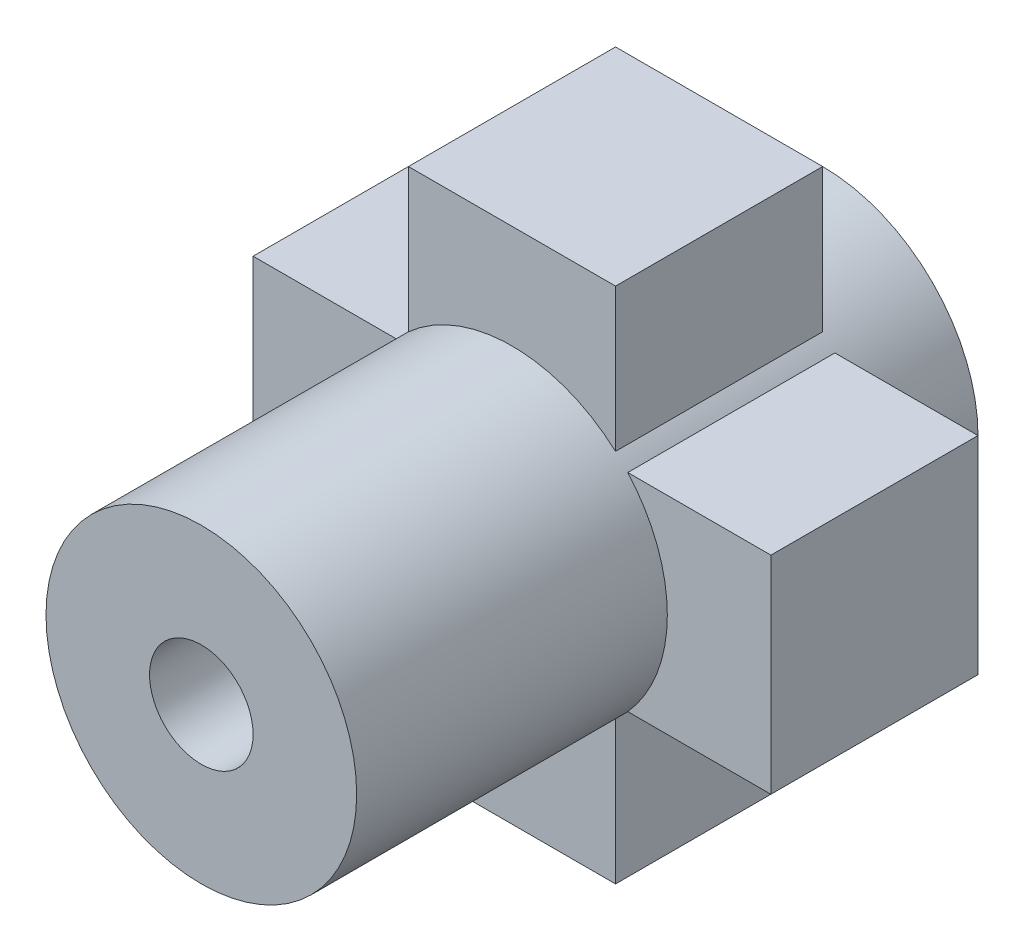
ISO-10303-21;
HEADER;
FILE_DESCRIPTION(('STEP AP214'),'2;1');
FILE_NAME('part.step','',(''),(''),'','','');
FILE_SCHEMA(('AUTOMOTIVE_DESIGN { 1 0 10303 214 1 1 1 1 }'));
ENDSEC;
DATA;
#1=APPLICATION_CONTEXT('core data for automotive mechanical design processes');
#2=APPLICATION_PROTOCOL_DEFINITION('international standard','automotive_design',2000,#1);
#3=PRODUCT_CONTEXT('',#1,'mechanical');
#4=PRODUCT('Part','Part','',(#3));
#5=PRODUCT_RELATED_PRODUCT_CATEGORY('part','',(#4));
#6=PRODUCT_DEFINITION_FORMATION('','',#4);
#7=PRODUCT_DEFINITION_CONTEXT('part definition',#1,'design');
#8=PRODUCT_DEFINITION('design','',#6,#7);
#9=PRODUCT_DEFINITION_SHAPE('','',#8);
#10=(LENGTH_UNIT() NAMED_UNIT(*) SI_UNIT(.MILLI.,.METRE.));
#11=(NAMED_UNIT(*) PLANE_ANGLE_UNIT() SI_UNIT($,.RADIAN.));
#12=(NAMED_UNIT(*) SI_UNIT($,.STERADIAN.) SOLID_ANGLE_UNIT());
#13=UNCERTAINTY_MEASURE_WITH_UNIT(LENGTH_MEASURE(1.E-05),#10,'distance_accuracy_value','');
#14=(GEOMETRIC_REPRESENTATION_CONTEXT(3) GLOBAL_UNCERTAINTY_ASSIGNED_CONTEXT((#13)) GLOBAL_UNIT_ASSIGNED_CONTEXT((#10,
#11,#12)) REPRESENTATION_CONTEXT('',''));
#15=CARTESIAN_POINT('',(0.,0.,0.));
#16=DIRECTION('',(0.,0.,1.));
#17=DIRECTION('',(1.,0.,0.));
#18=AXIS2_PLACEMENT_3D('',#15,#16,#17);
#19=CARTESIAN_POINT('',(0.,0.,10.));
#20=DIRECTION('',(0.,0.,1.));
#21=DIRECTION('',(1.,0.,0.));
#22=AXIS2_PLACEMENT_3D('',#19,#20,#21);
#23=PLANE('',#22);
#24=CARTESIAN_POINT('',(0.,0.,10.));
#25=DIRECTION('',(0.,0.,1.));
#26=DIRECTION('',(1.,0.,0.));
#27=AXIS2_PLACEMENT_3D('',#24,#25,#26);
#28=CIRCLE('',#27,7.5);
#29=CARTESIAN_POINT('',(5.00000000000004,5.59016994374944,10.));
#30=VERTEX_POINT('',#29);
#31=CARTESIAN_POINT('',(-4.99999999999996,5.59016994374951,10.));
#32=VERTEX_POINT('',#31);
#33=EDGE_CURVE('E153',#30,#32,#28,.T.);
#34=ORIENTED_EDGE('',*,*,#33,.F.);
#35=DIRECTION('',(0.,1.,0.));
#36=VECTOR('',#35,1.);
#37=CARTESIAN_POINT('',(5.,0.,10.));
#38=LINE('',#37,#36);
#39=CARTESIAN_POINT('',(5.00000000000009,12.5,10.));
#40=VERTEX_POINT('',#39);
#41=EDGE_CURVE('E309',#30,#40,#38,.T.);
#42=ORIENTED_EDGE('',*,*,#41,.T.);
#43=DIRECTION('',(-1.,0.,0.));
#44=VECTOR('',#43,1.);
#45=CARTESIAN_POINT('',(0.,12.5,10.));
#46=LINE('',#45,#44);
#47=CARTESIAN_POINT('',(-4.99999999999991,12.5,10.));
#48=VERTEX_POINT('',#47);
#49=EDGE_CURVE('E174',#40,#48,#46,.T.);
#50=ORIENTED_EDGE('',*,*,#49,.T.);
#51=DIRECTION('',(0.,1.,0.));
#52=VECTOR('',#51,1.);
#53=CARTESIAN_POINT('',(-5.,0.,10.));
#54=LINE('',#53,#52);
#55=EDGE_CURVE('E168',#32,#48,#54,.T.);
#56=ORIENTED_EDGE('',*,*,#55,.F.);
#57=EDGE_LOOP('',(#34,#42,#50,#56));
#58=FACE_BOUND('',#57,.T.);
#59=ADVANCED_FACE('F43',(#58),#23,.T.);
#60=CARTESIAN_POINT('',(-5.59016994374946,5.00000000000002,10.));
#61=VERTEX_POINT('',#60);
#62=CARTESIAN_POINT('',(-5.59016994374949,-4.99999999999998,10.));
#63=VERTEX_POINT('',#62);
#64=EDGE_CURVE('E145',#61,#63,#28,.T.);
#65=ORIENTED_EDGE('',*,*,#64,.F.);
#66=DIRECTION('',(-1.,0.,0.));
#67=VECTOR('',#66,1.);
#68=CARTESIAN_POINT('',(0.,5.,10.));
#69=LINE('',#68,#67);
#70=CARTESIAN_POINT('',(-12.5,5.00000000000004,10.));
#71=VERTEX_POINT('',#70);
#72=EDGE_CURVE('E149',#61,#71,#69,.T.);
#73=ORIENTED_EDGE('',*,*,#72,.T.);
#74=DIRECTION('',(0.,-1.,0.));
#75=VECTOR('',#74,1.);
#76=CARTESIAN_POINT('',(-12.5,0.,10.));
#77=LINE('',#76,#75);
#78=CARTESIAN_POINT('',(-12.5,-4.99999999999996,10.));
#79=VERTEX_POINT('',#78);
#80=EDGE_CURVE('E62',#71,#79,#77,.T.);
#81=ORIENTED_EDGE('',*,*,#80,.T.);
#82=DIRECTION('',(-1.,0.,0.));
#83=VECTOR('',#82,1.);
#84=CARTESIAN_POINT('',(0.,-5.,10.));
#85=LINE('',#84,#83);
#86=EDGE_CURVE('E150',#63,#79,#85,.T.);
#87=ORIENTED_EDGE('',*,*,#86,.F.);
#88=EDGE_LOOP('',(#65,#73,#81,#87));
#89=FACE_BOUND('',#88,.T.);
#90=ADVANCED_FACE('F147',(#89),#23,.T.);
#91=CARTESIAN_POINT('',(-5.,-5.59016994374948,10.));
#92=VERTEX_POINT('',#91);
#93=CARTESIAN_POINT('',(5.,-5.59016994374947,10.));
#94=VERTEX_POINT('',#93);
#95=EDGE_CURVE('E154',#92,#94,#28,.T.);
#96=ORIENTED_EDGE('',*,*,#95,.F.);
#97=DIRECTION('',(0.,-1.,0.));
#98=VECTOR('',#97,1.);
#99=CARTESIAN_POINT('',(-5.,0.,10.));
#100=LINE('',#99,#98);
#101=CARTESIAN_POINT('',(-5.,-12.5,10.));
#102=VERTEX_POINT('',#101);
#103=EDGE_CURVE('E360',#92,#102,#100,.T.);
#104=ORIENTED_EDGE('',*,*,#103,.T.);
#105=DIRECTION('',(1.,0.,0.));
#106=VECTOR('',#105,1.);
#107=CARTESIAN_POINT('',(0.,-12.5,10.));
#108=LINE('',#107,#106);
#109=CARTESIAN_POINT('',(5.,-12.5,10.));
#110=VERTEX_POINT('',#109);
#111=EDGE_CURVE('E357',#102,#110,#108,.T.);
#112=ORIENTED_EDGE('',*,*,#111,.T.);
#113=DIRECTION('',(0.,-1.,0.));
#114=VECTOR('',#113,1.);
#115=CARTESIAN_POINT('',(5.,0.,10.));
#116=LINE('',#115,#114);
#117=EDGE_CURVE('E353',#94,#110,#116,.T.);
#118=ORIENTED_EDGE('',*,*,#117,.F.);
#119=EDGE_LOOP('',(#96,#104,#112,#118));
#120=FACE_BOUND('',#119,.T.);
#121=ADVANCED_FACE('F379',(#120),#23,.T.);
#122=CARTESIAN_POINT('',(0.,0.,0.));
#123=DIRECTION('',(0.,0.,1.));
#124=DIRECTION('',(1.,0.,0.));
#125=AXIS2_PLACEMENT_3D('',#122,#123,#124);
#126=PLANE('',#125);
#127=DIRECTION('',(0.,1.,0.));
#128=VECTOR('',#127,1.);
#129=CARTESIAN_POINT('',(5.,0.,0.));
#130=LINE('',#129,#128);
#131=CARTESIAN_POINT('',(5.00000000000004,5.59016994374944,0.));
#132=VERTEX_POINT('',#131);
#133=CARTESIAN_POINT('',(5.00000000000009,12.5,0.));
#134=VERTEX_POINT('',#133);
#135=EDGE_CURVE('E204',#132,#134,#130,.T.);
#136=ORIENTED_EDGE('',*,*,#135,.F.);
#137=CARTESIAN_POINT('',(0.,0.,0.));
#138=DIRECTION('',(0.,0.,1.));
#139=DIRECTION('',(1.,0.,0.));
#140=AXIS2_PLACEMENT_3D('',#137,#138,#139);
#141=CIRCLE('',#140,7.5);
#142=CARTESIAN_POINT('',(-4.99999999999996,5.59016994374951,0.));
#143=VERTEX_POINT('',#142);
#144=EDGE_CURVE('E11',#132,#143,#141,.T.);
#145=ORIENTED_EDGE('',*,*,#144,.T.);
#146=DIRECTION('',(0.,1.,0.));
#147=VECTOR('',#146,1.);
#148=CARTESIAN_POINT('',(-5.,0.,0.));
#149=LINE('',#148,#147);
#150=CARTESIAN_POINT('',(-4.99999999999991,12.5,0.));
#151=VERTEX_POINT('',#150);
#152=EDGE_CURVE('E211',#143,#151,#149,.T.);
#153=ORIENTED_EDGE('',*,*,#152,.T.);
#154=DIRECTION('',(-1.,0.,0.));
#155=VECTOR('',#154,1.);
#156=CARTESIAN_POINT('',(0.,12.5,0.));
#157=LINE('',#156,#155);
#158=EDGE_CURVE('E207',#134,#151,#157,.T.);
#159=ORIENTED_EDGE('',*,*,#158,.F.);
#160=EDGE_LOOP('',(#136,#145,#153,#159));
#161=FACE_BOUND('',#160,.T.);
#162=ADVANCED_FACE('F339',(#161),#126,.F.);
#163=DIRECTION('',(-1.,0.,0.));
#164=VECTOR('',#163,1.);
#165=CARTESIAN_POINT('',(0.,5.,0.));
#166=LINE('',#165,#164);
#167=CARTESIAN_POINT('',(-5.59016994374946,5.00000000000002,0.));
#168=VERTEX_POINT('',#167);
#169=CARTESIAN_POINT('',(-12.5,5.00000000000004,0.));
#170=VERTEX_POINT('',#169);
#171=EDGE_CURVE('E95',#168,#170,#166,.T.);
#172=ORIENTED_EDGE('',*,*,#171,.F.);
#173=CARTESIAN_POINT('',(-5.59016994374949,-4.99999999999998,0.));
#174=VERTEX_POINT('',#173);
#175=EDGE_CURVE('E54',#168,#174,#141,.T.);
#176=ORIENTED_EDGE('',*,*,#175,.T.);
#177=DIRECTION('',(-1.,0.,0.));
#178=VECTOR('',#177,1.);
#179=CARTESIAN_POINT('',(0.,-5.,0.));
#180=LINE('',#179,#178);
#181=CARTESIAN_POINT('',(-12.5,-4.99999999999996,0.));
#182=VERTEX_POINT('',#181);
#183=EDGE_CURVE('E178',#174,#182,#180,.T.);
#184=ORIENTED_EDGE('',*,*,#183,.T.);
#185=DIRECTION('',(0.,-1.,0.));
#186=VECTOR('',#185,1.);
#187=CARTESIAN_POINT('',(-12.5,0.,0.));
#188=LINE('',#187,#186);
#189=EDGE_CURVE('E217',#170,#182,#188,.T.);
#190=ORIENTED_EDGE('',*,*,#189,.F.);
#191=EDGE_LOOP('',(#172,#176,#184,#190));
#192=FACE_BOUND('',#191,.T.);
#193=ADVANCED_FACE('F282',(#192),#126,.F.);
#194=DIRECTION('',(0.,-1.,0.));
#195=VECTOR('',#194,1.);
#196=CARTESIAN_POINT('',(-5.,0.,0.));
#197=LINE('',#196,#195);
#198=CARTESIAN_POINT('',(-5.,-5.59016994374948,0.));
#199=VERTEX_POINT('',#198);
#200=CARTESIAN_POINT('',(-5.,-12.5,0.));
#201=VERTEX_POINT('',#200);
#202=EDGE_CURVE('E182',#199,#201,#197,.T.);
#203=ORIENTED_EDGE('',*,*,#202,.F.);
#204=CARTESIAN_POINT('',(5.,-5.59016994374947,0.));
#205=VERTEX_POINT('',#204);
#206=EDGE_CURVE('E270',#199,#205,#141,.T.);
#207=ORIENTED_EDGE('',*,*,#206,.T.);
#208=DIRECTION('',(0.,-1.,0.));
#209=VECTOR('',#208,1.);
#210=CARTESIAN_POINT('',(5.,0.,0.));
#211=LINE('',#210,#209);
#212=CARTESIAN_POINT('',(5.,-12.5,0.));
#213=VERTEX_POINT('',#212);
#214=EDGE_CURVE('E189',#205,#213,#211,.T.);
#215=ORIENTED_EDGE('',*,*,#214,.T.);
#216=DIRECTION('',(1.,0.,0.));
#217=VECTOR('',#216,1.);
#218=CARTESIAN_POINT('',(0.,-12.5,0.));
#219=LINE('',#218,#217);
#220=EDGE_CURVE('E185',#201,#213,#219,.T.);
#221=ORIENTED_EDGE('',*,*,#220,.F.);
#222=EDGE_LOOP('',(#203,#207,#215,#221));
#223=FACE_BOUND('',#222,.T.);
#224=ADVANCED_FACE('F365',(#223),#126,.F.);
#225=CARTESIAN_POINT('',(0.,-5.,10.));
#226=DIRECTION('',(0.,-1.,0.));
#227=DIRECTION('',(1.,0.,0.));
#228=AXIS2_PLACEMENT_3D('',#225,#226,#227);
#229=PLANE('',#228);
#230=ORIENTED_EDGE('',*,*,#183,.F.);
#231=DIRECTION('',(0.,0.,-1.));
#232=VECTOR('',#231,1.);
#233=CARTESIAN_POINT('',(-5.59016994374949,-4.99999999999998,10.));
#234=LINE('',#233,#232);
#235=EDGE_CURVE('E108',#63,#174,#234,.T.);
#236=ORIENTED_EDGE('',*,*,#235,.F.);
#237=ORIENTED_EDGE('',*,*,#86,.T.);
#238=DIRECTION('',(0.,0.,-1.));
#239=VECTOR('',#238,1.);
#240=CARTESIAN_POINT('',(-12.5,-4.99999999999996,10.));
#241=LINE('',#240,#239);
#242=EDGE_CURVE('E102',#79,#182,#241,.T.);
#243=ORIENTED_EDGE('',*,*,#242,.T.);
#244=EDGE_LOOP('',(#230,#236,#237,#243));
#245=FACE_BOUND('',#244,.T.);
#246=ADVANCED_FACE('F45',(#245),#229,.T.);
#247=CARTESIAN_POINT('',(-5.,0.,10.));
#248=DIRECTION('',(1.,0.,0.));
#249=DIRECTION('',(0.,1.,0.));
#250=AXIS2_PLACEMENT_3D('',#247,#248,#249);
#251=PLANE('',#250);
#252=ORIENTED_EDGE('',*,*,#202,.T.);
#253=DIRECTION('',(0.,0.,-1.));
#254=VECTOR('',#253,1.);
#255=CARTESIAN_POINT('',(-5.,-12.5,10.));
#256=LINE('',#255,#254);
#257=EDGE_CURVE('E260',#102,#201,#256,.T.);
#258=ORIENTED_EDGE('',*,*,#257,.F.);
#259=ORIENTED_EDGE('',*,*,#103,.F.);
#260=DIRECTION('',(0.,0.,-1.));
#261=VECTOR('',#260,1.);
#262=CARTESIAN_POINT('',(-5.,-5.59016994374948,10.));
#263=LINE('',#262,#261);
#264=EDGE_CURVE('E264',#92,#199,#263,.T.);
#265=ORIENTED_EDGE('',*,*,#264,.T.);
#266=EDGE_LOOP('',(#252,#258,#259,#265));
#267=FACE_BOUND('',#266,.T.);
#268=ADVANCED_FACE('F364',(#267),#251,.F.);
#269=CARTESIAN_POINT('',(0.,-12.5,10.));
#270=DIRECTION('',(0.,1.,0.));
#271=DIRECTION('',(0.,0.,1.));
#272=AXIS2_PLACEMENT_3D('',#269,#270,#271);
#273=PLANE('',#272);
#274=ORIENTED_EDGE('',*,*,#220,.T.);
#275=DIRECTION('',(0.,0.,-1.));
#276=VECTOR('',#275,1.);
#277=CARTESIAN_POINT('',(5.,-12.5,10.));
#278=LINE('',#277,#276);
#279=EDGE_CURVE('E257',#110,#213,#278,.T.);
#280=ORIENTED_EDGE('',*,*,#279,.F.);
#281=ORIENTED_EDGE('',*,*,#111,.F.);
#282=ORIENTED_EDGE('',*,*,#257,.T.);
#283=EDGE_LOOP('',(#274,#280,#281,#282));
#284=FACE_BOUND('',#283,.T.);
#285=ADVANCED_FACE('F370',(#284),#273,.F.);
#286=CARTESIAN_POINT('',(5.,0.,10.));
#287=DIRECTION('',(1.,0.,0.));
#288=DIRECTION('',(0.,1.,0.));
#289=AXIS2_PLACEMENT_3D('',#286,#287,#288);
#290=PLANE('',#289);
#291=ORIENTED_EDGE('',*,*,#214,.F.);
#292=DIRECTION('',(0.,0.,-1.));
#293=VECTOR('',#292,1.);
#294=CARTESIAN_POINT('',(5.,-5.59016994374947,10.));
#295=LINE('',#294,#293);
#296=EDGE_CURVE('E253',#94,#205,#295,.T.);
#297=ORIENTED_EDGE('',*,*,#296,.F.);
#298=ORIENTED_EDGE('',*,*,#117,.T.);
#299=ORIENTED_EDGE('',*,*,#279,.T.);
#300=EDGE_LOOP('',(#291,#297,#298,#299));
#301=FACE_BOUND('',#300,.T.);
#302=ADVANCED_FACE('F405',(#301),#290,.T.);
#303=CARTESIAN_POINT('',(0.,-5.,10.));
#304=DIRECTION('',(0.,1.,0.));
#305=DIRECTION('',(-1.,0.,0.));
#306=AXIS2_PLACEMENT_3D('',#303,#304,#305);
#307=PLANE('',#306);
#308=DIRECTION('',(1.,0.,0.));
#309=VECTOR('',#308,1.);
#310=CARTESIAN_POINT('',(0.,-5.,0.));
#311=LINE('',#310,#309);
#312=CARTESIAN_POINT('',(5.59016994374942,-5.00000000000006,0.));
#313=VERTEX_POINT('',#312);
#314=CARTESIAN_POINT('',(12.4999999999999,-5.00000000000013,0.));
#315=VERTEX_POINT('',#314);
#316=EDGE_CURVE('E193',#313,#315,#311,.T.);
#317=ORIENTED_EDGE('',*,*,#316,.T.);
#318=DIRECTION('',(0.,0.,-1.));
#319=VECTOR('',#318,1.);
#320=CARTESIAN_POINT('',(12.4999999999999,-5.00000000000013,10.));
#321=LINE('',#320,#319);
#322=CARTESIAN_POINT('',(12.4999999999999,-5.00000000000013,10.));
#323=VERTEX_POINT('',#322);
#324=EDGE_CURVE('E245',#323,#315,#321,.T.);
#325=ORIENTED_EDGE('',*,*,#324,.F.);
#326=DIRECTION('',(1.,0.,0.));
#327=VECTOR('',#326,1.);
#328=CARTESIAN_POINT('',(0.,-5.,10.));
#329=LINE('',#328,#327);
#330=CARTESIAN_POINT('',(5.59016994374942,-5.00000000000006,10.));
#331=VERTEX_POINT('',#330);
#332=EDGE_CURVE('E350',#331,#323,#329,.T.);
#333=ORIENTED_EDGE('',*,*,#332,.F.);
#334=DIRECTION('',(0.,0.,-1.));
#335=VECTOR('',#334,1.);
#336=CARTESIAN_POINT('',(5.59016994374942,-5.00000000000006,10.));
#337=LINE('',#336,#335);
#338=EDGE_CURVE('E249',#331,#313,#337,.T.);
#339=ORIENTED_EDGE('',*,*,#338,.T.);
#340=EDGE_LOOP('',(#317,#325,#333,#339));
#341=FACE_BOUND('',#340,.T.);
#342=ADVANCED_FACE('F409',(#341),#307,.F.);
#343=CARTESIAN_POINT('',(12.5,-1.30104260698261E-13,10.));
#344=DIRECTION('',(-1.,0.,0.));
#345=DIRECTION('',(0.,-1.,0.));
#346=AXIS2_PLACEMENT_3D('',#343,#344,#345);
#347=PLANE('',#346);
#348=DIRECTION('',(0.,1.,0.));
#349=VECTOR('',#348,1.);
#350=CARTESIAN_POINT('',(12.5,-1.30104260698261E-13,0.));
#351=LINE('',#350,#349);
#352=CARTESIAN_POINT('',(12.5000000000001,4.99999999999987,0.));
#353=VERTEX_POINT('',#352);
#354=EDGE_CURVE('E196',#315,#353,#351,.T.);
#355=ORIENTED_EDGE('',*,*,#354,.T.);
#356=DIRECTION('',(0.,0.,-1.));
#357=VECTOR('',#356,1.);
#358=CARTESIAN_POINT('',(12.5000000000001,4.99999999999987,10.));
#359=LINE('',#358,#357);
#360=CARTESIAN_POINT('',(12.5000000000001,4.99999999999987,10.));
#361=VERTEX_POINT('',#360);
#362=EDGE_CURVE('E242',#361,#353,#359,.T.);
#363=ORIENTED_EDGE('',*,*,#362,.F.);
#364=DIRECTION('',(0.,1.,0.));
#365=VECTOR('',#364,1.);
#366=CARTESIAN_POINT('',(12.5,-1.30104260698261E-13,10.));
#367=LINE('',#366,#365);
#368=EDGE_CURVE('E305',#323,#361,#367,.T.);
#369=ORIENTED_EDGE('',*,*,#368,.F.);
#370=ORIENTED_EDGE('',*,*,#324,.T.);
#371=EDGE_LOOP('',(#355,#363,#369,#370));
#372=FACE_BOUND('',#371,.T.);
#373=ADVANCED_FACE('F413',(#372),#347,.F.);
#374=CARTESIAN_POINT('',(0.,5.,10.));
#375=DIRECTION('',(0.,1.,0.));
#376=DIRECTION('',(-1.,0.,0.));
#377=AXIS2_PLACEMENT_3D('',#374,#375,#376);
#378=PLANE('',#377);
#379=DIRECTION('',(1.,0.,0.));
#380=VECTOR('',#379,1.);
#381=CARTESIAN_POINT('',(0.,5.,0.));
#382=LINE('',#381,#380);
#383=CARTESIAN_POINT('',(5.59016994374953,4.99999999999994,0.));
#384=VERTEX_POINT('',#383);
#385=EDGE_CURVE('E200',#384,#353,#382,.T.);
#386=ORIENTED_EDGE('',*,*,#385,.F.);
#387=DIRECTION('',(0.,0.,-1.));
#388=VECTOR('',#387,1.);
#389=CARTESIAN_POINT('',(5.59016994374953,4.99999999999994,10.));
#390=LINE('',#389,#388);
#391=CARTESIAN_POINT('',(5.59016994374953,4.99999999999994,10.));
#392=VERTEX_POINT('',#391);
#393=EDGE_CURVE('E238',#392,#384,#390,.T.);
#394=ORIENTED_EDGE('',*,*,#393,.F.);
#395=DIRECTION('',(1.,0.,0.));
#396=VECTOR('',#395,1.);
#397=CARTESIAN_POINT('',(0.,5.,10.));
#398=LINE('',#397,#396);
#399=EDGE_CURVE('E298',#392,#361,#398,.T.);
#400=ORIENTED_EDGE('',*,*,#399,.T.);
#401=ORIENTED_EDGE('',*,*,#362,.T.);
#402=EDGE_LOOP('',(#386,#394,#400,#401));
#403=FACE_BOUND('',#402,.T.);
#404=ADVANCED_FACE('F312',(#403),#378,.T.);
#405=CARTESIAN_POINT('',(5.,0.,10.));
#406=DIRECTION('',(-1.,0.,0.));
#407=DIRECTION('',(0.,-1.,0.));
#408=AXIS2_PLACEMENT_3D('',#405,#406,#407);
#409=PLANE('',#408);
#410=ORIENTED_EDGE('',*,*,#135,.T.);
#411=DIRECTION('',(0.,0.,-1.));
#412=VECTOR('',#411,1.);
#413=CARTESIAN_POINT('',(5.00000000000009,12.5,10.));
#414=LINE('',#413,#412);
#415=EDGE_CURVE('E230',#40,#134,#414,.T.);
#416=ORIENTED_EDGE('',*,*,#415,.F.);
#417=ORIENTED_EDGE('',*,*,#41,.F.);
#418=DIRECTION('',(0.,0.,-1.));
#419=VECTOR('',#418,1.);
#420=CARTESIAN_POINT('',(5.00000000000004,5.59016994374944,10.));
#421=LINE('',#420,#419);
#422=EDGE_CURVE('E234',#30,#132,#421,.T.);
#423=ORIENTED_EDGE('',*,*,#422,.T.);
#424=EDGE_LOOP('',(#410,#416,#417,#423));
#425=FACE_BOUND('',#424,.T.);
#426=ADVANCED_FACE('F341',(#425),#409,.F.);
#427=CARTESIAN_POINT('',(0.,12.5,10.));
#428=DIRECTION('',(0.,-1.,0.));
#429=DIRECTION('',(1.,0.,0.));
#430=AXIS2_PLACEMENT_3D('',#427,#428,#429);
#431=PLANE('',#430);
#432=ORIENTED_EDGE('',*,*,#158,.T.);
#433=DIRECTION('',(0.,0.,-1.));
#434=VECTOR('',#433,1.);
#435=CARTESIAN_POINT('',(-4.99999999999991,12.5,10.));
#436=LINE('',#435,#434);
#437=EDGE_CURVE('E227',#48,#151,#436,.T.);
#438=ORIENTED_EDGE('',*,*,#437,.F.);
#439=ORIENTED_EDGE('',*,*,#49,.F.);
#440=ORIENTED_EDGE('',*,*,#415,.T.);
#441=EDGE_LOOP('',(#432,#438,#439,#440));
#442=FACE_BOUND('',#441,.T.);
#443=ADVANCED_FACE('F343',(#442),#431,.F.);
#444=CARTESIAN_POINT('',(-5.,0.,10.));
#445=DIRECTION('',(-1.,0.,0.));
#446=DIRECTION('',(0.,-1.,0.));
#447=AXIS2_PLACEMENT_3D('',#444,#445,#446);
#448=PLANE('',#447);
#449=ORIENTED_EDGE('',*,*,#152,.F.);
#450=DIRECTION('',(0.,0.,-1.));
#451=VECTOR('',#450,1.);
#452=CARTESIAN_POINT('',(-4.99999999999996,5.59016994374951,10.));
#453=LINE('',#452,#451);
#454=EDGE_CURVE('E163',#32,#143,#453,.T.);
#455=ORIENTED_EDGE('',*,*,#454,.F.);
#456=ORIENTED_EDGE('',*,*,#55,.T.);
#457=ORIENTED_EDGE('',*,*,#437,.T.);
#458=EDGE_LOOP('',(#449,#455,#456,#457));
#459=FACE_BOUND('',#458,.T.);
#460=ADVANCED_FACE('F335',(#459),#448,.T.);
#461=CARTESIAN_POINT('',(0.,0.,10.));
#462=DIRECTION('',(0.,0.,-1.));
#463=DIRECTION('',(-1.,0.,0.));
#464=AXIS2_PLACEMENT_3D('',#461,#462,#463);
#465=CYLINDRICAL_SURFACE('',#464,7.5);
#466=ORIENTED_EDGE('',*,*,#422,.F.);
#467=ORIENTED_EDGE('',*,*,#33,.T.);
#468=ORIENTED_EDGE('',*,*,#454,.T.);
#469=ORIENTED_EDGE('',*,*,#144,.F.);
#470=EDGE_LOOP('',(#466,#467,#468,#469));
#471=FACE_BOUND('',#470,.T.);
#472=DIRECTION('',(0.,0.,-1.));
#473=VECTOR('',#472,1.);
#474=CARTESIAN_POINT('',(-5.59016994374946,5.00000000000002,10.));
#475=LINE('',#474,#473);
#476=EDGE_CURVE('E157',#61,#168,#475,.T.);
#477=ORIENTED_EDGE('',*,*,#476,.F.);
#478=ORIENTED_EDGE('',*,*,#64,.T.);
#479=ORIENTED_EDGE('',*,*,#235,.T.);
#480=ORIENTED_EDGE('',*,*,#175,.F.);
#481=EDGE_LOOP('',(#477,#478,#479,#480));
#482=FACE_BOUND('',#481,.T.);
#483=ORIENTED_EDGE('',*,*,#264,.F.);
#484=ORIENTED_EDGE('',*,*,#95,.T.);
#485=ORIENTED_EDGE('',*,*,#296,.T.);
#486=ORIENTED_EDGE('',*,*,#206,.F.);
#487=EDGE_LOOP('',(#483,#484,#485,#486));
#488=FACE_BOUND('',#487,.T.);
#489=EDGE_CURVE('E302',#331,#392,#28,.T.);
#490=ORIENTED_EDGE('',*,*,#489,.T.);
#491=ORIENTED_EDGE('',*,*,#393,.T.);
#492=EDGE_CURVE('E47',#313,#384,#141,.T.);
#493=ORIENTED_EDGE('',*,*,#492,.F.);
#494=ORIENTED_EDGE('',*,*,#338,.F.);
#495=EDGE_LOOP('',(#490,#491,#493,#494));
#496=FACE_BOUND('',#495,.T.);
#497=CARTESIAN_POINT('',(0.,0.,-5.));
#498=DIRECTION('',(0.,0.,1.));
#499=DIRECTION('',(1.,0.,0.));
#500=AXIS2_PLACEMENT_3D('',#497,#498,#499);
#501=CIRCLE('',#500,7.5);
#502=CARTESIAN_POINT('',(7.5,0.,-5.));
#503=VERTEX_POINT('',#502);
#504=EDGE_CURVE('E317',#503,#503,#501,.T.);
#505=ORIENTED_EDGE('',*,*,#504,.T.);
#506=EDGE_LOOP('',(#505));
#507=FACE_BOUND('',#506,.T.);
#508=CARTESIAN_POINT('',(0.,0.,25.));
#509=DIRECTION('',(0.,0.,1.));
#510=DIRECTION('',(1.,0.,0.));
#511=AXIS2_PLACEMENT_3D('',#508,#509,#510);
#512=CIRCLE('',#511,7.5);
#513=CARTESIAN_POINT('',(7.5,0.,25.));
#514=VERTEX_POINT('',#513);
#515=EDGE_CURVE('E537',#514,#514,#512,.T.);
#516=ORIENTED_EDGE('',*,*,#515,.F.);
#517=EDGE_LOOP('',(#516));
#518=FACE_BOUND('',#517,.T.);
#519=ADVANCED_FACE('F158',(#471,#482,#488,#496,#507,#518),#465,.T.);
#520=CARTESIAN_POINT('',(0.,5.,10.));
#521=DIRECTION('',(0.,-1.,0.));
#522=DIRECTION('',(1.,0.,0.));
#523=AXIS2_PLACEMENT_3D('',#520,#521,#522);
#524=PLANE('',#523);
#525=ORIENTED_EDGE('',*,*,#171,.T.);
#526=DIRECTION('',(0.,0.,-1.));
#527=VECTOR('',#526,1.);
#528=CARTESIAN_POINT('',(-12.5,5.00000000000004,10.));
#529=LINE('',#528,#527);
#530=EDGE_CURVE('E164',#71,#170,#529,.T.);
#531=ORIENTED_EDGE('',*,*,#530,.F.);
#532=ORIENTED_EDGE('',*,*,#72,.F.);
#533=ORIENTED_EDGE('',*,*,#476,.T.);
#534=EDGE_LOOP('',(#525,#531,#532,#533));
#535=FACE_BOUND('',#534,.T.);
#536=ADVANCED_FACE('F166',(#535),#524,.F.);
#537=CARTESIAN_POINT('',(-12.5,0.,10.));
#538=DIRECTION('',(1.,0.,0.));
#539=DIRECTION('',(0.,1.,0.));
#540=AXIS2_PLACEMENT_3D('',#537,#538,#539);
#541=PLANE('',#540);
#542=ORIENTED_EDGE('',*,*,#189,.T.);
#543=ORIENTED_EDGE('',*,*,#242,.F.);
#544=ORIENTED_EDGE('',*,*,#80,.F.);
#545=ORIENTED_EDGE('',*,*,#530,.T.);
#546=EDGE_LOOP('',(#542,#543,#544,#545));
#547=FACE_BOUND('',#546,.T.);
#548=ADVANCED_FACE('F382',(#547),#541,.F.);
#549=ORIENTED_EDGE('',*,*,#489,.F.);
#550=ORIENTED_EDGE('',*,*,#332,.T.);
#551=ORIENTED_EDGE('',*,*,#368,.T.);
#552=ORIENTED_EDGE('',*,*,#399,.F.);
#553=EDGE_LOOP('',(#549,#550,#551,#552));
#554=FACE_BOUND('',#553,.T.);
#555=ADVANCED_FACE('F300',(#554),#23,.T.);
#556=ORIENTED_EDGE('',*,*,#316,.F.);
#557=ORIENTED_EDGE('',*,*,#492,.T.);
#558=ORIENTED_EDGE('',*,*,#385,.T.);
#559=ORIENTED_EDGE('',*,*,#354,.F.);
#560=EDGE_LOOP('',(#556,#557,#558,#559));
#561=FACE_BOUND('',#560,.T.);
#562=ADVANCED_FACE('F373',(#561),#126,.F.);
#563=CARTESIAN_POINT('',(0.,0.,-5.));
#564=DIRECTION('',(0.,0.,1.));
#565=DIRECTION('',(1.,0.,0.));
#566=AXIS2_PLACEMENT_3D('',#563,#564,#565);
#567=PLANE('',#566);
#568=CARTESIAN_POINT('',(0.,0.,-5.));
#569=DIRECTION('',(0.,0.,1.));
#570=DIRECTION('',(1.,0.,0.));
#571=AXIS2_PLACEMENT_3D('',#568,#569,#570);
#572=CIRCLE('',#571,2.5);
#573=CARTESIAN_POINT('',(2.5,0.,-5.));
#574=VERTEX_POINT('',#573);
#575=EDGE_CURVE('E322',#574,#574,#572,.T.);
#576=ORIENTED_EDGE('',*,*,#575,.T.);
#577=EDGE_LOOP('',(#576));
#578=FACE_BOUND('',#577,.T.);
#579=ORIENTED_EDGE('',*,*,#504,.F.);
#580=EDGE_LOOP('',(#579));
#581=FACE_BOUND('',#580,.T.);
#582=ADVANCED_FACE('F387',(#578,#581),#567,.F.);
#583=CARTESIAN_POINT('',(0.,0.,10.));
#584=DIRECTION('',(0.,0.,-1.));
#585=DIRECTION('',(-1.,0.,0.));
#586=AXIS2_PLACEMENT_3D('',#583,#584,#585);
#587=CYLINDRICAL_SURFACE('',#586,2.5);
#588=ORIENTED_EDGE('',*,*,#575,.F.);
#589=EDGE_LOOP('',(#588));
#590=FACE_BOUND('',#589,.T.);
#591=CARTESIAN_POINT('',(0.,0.,25.));
#592=DIRECTION('',(0.,0.,1.));
#593=DIRECTION('',(1.,0.,0.));
#594=AXIS2_PLACEMENT_3D('',#591,#592,#593);
#595=CIRCLE('',#594,2.5);
#596=CARTESIAN_POINT('',(2.5,0.,25.));
#597=VERTEX_POINT('',#596);
#598=EDGE_CURVE('E540',#597,#597,#595,.T.);
#599=ORIENTED_EDGE('',*,*,#598,.T.);
#600=EDGE_LOOP('',(#599));
#601=FACE_BOUND('',#600,.T.);
#602=ADVANCED_FACE('F509',(#590,#601),#587,.F.);
#603=CARTESIAN_POINT('',(0.,0.,25.));
#604=DIRECTION('',(0.,0.,1.));
#605=DIRECTION('',(1.,0.,0.));
#606=AXIS2_PLACEMENT_3D('',#603,#604,#605);
#607=PLANE('',#606);
#608=ORIENTED_EDGE('',*,*,#515,.T.);
#609=EDGE_LOOP('',(#608));
#610=FACE_BOUND('',#609,.T.);
#611=ORIENTED_EDGE('',*,*,#598,.F.);
#612=EDGE_LOOP('',(#611));
#613=FACE_BOUND('',#612,.T.);
#614=ADVANCED_FACE('F518',(#610,#613),#607,.T.);
#615=CLOSED_SHELL('',(#59,#90,#121,#162,#193,#224,#246,#268,#285,#302,#342,#373,#404,#426,#443,
#460,#519,#536,#548,#555,#562,#582,#602,#614));
#616=MANIFOLD_SOLID_BREP('B2',#615);
#617=ADVANCED_BREP_SHAPE_REPRESENTATION('',(#18,#616),#14);
#618=SHAPE_DEFINITION_REPRESENTATION(#9,#617);
ENDSEC;
END-ISO-10303-21;
